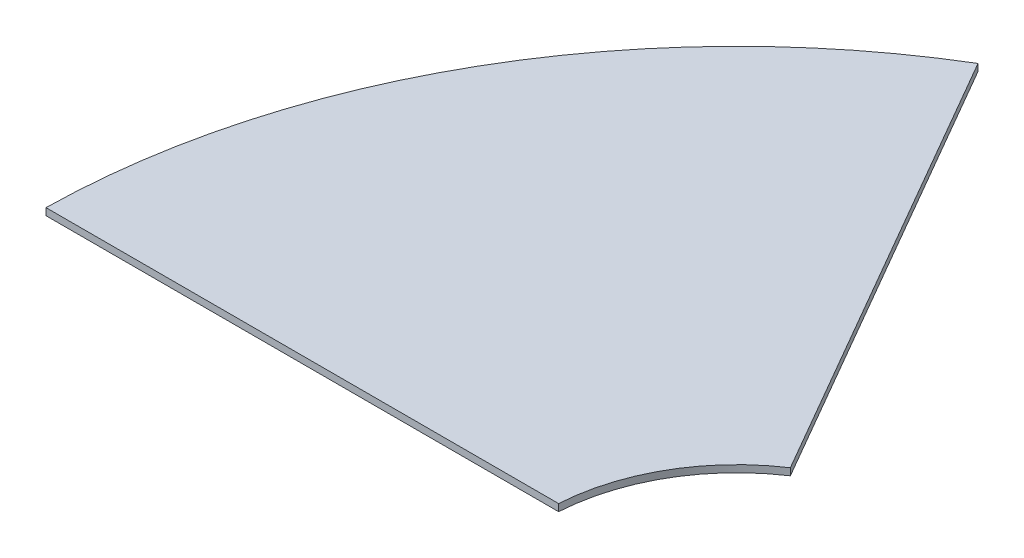
ISO-10303-21;
HEADER;
FILE_DESCRIPTION(('STEP AP214'),'2;1');
FILE_NAME('part.step','',(''),(''),'','','');
FILE_SCHEMA(('AUTOMOTIVE_DESIGN { 1 0 10303 214 1 1 1 1 }'));
ENDSEC;
DATA;
#1=APPLICATION_CONTEXT('core data for automotive mechanical design processes');
#2=APPLICATION_PROTOCOL_DEFINITION('international standard','automotive_design',2000,#1);
#3=PRODUCT_CONTEXT('',#1,'mechanical');
#4=PRODUCT('Part','Part','',(#3));
#5=PRODUCT_RELATED_PRODUCT_CATEGORY('part','',(#4));
#6=PRODUCT_DEFINITION_FORMATION('','',#4);
#7=PRODUCT_DEFINITION_CONTEXT('part definition',#1,'design');
#8=PRODUCT_DEFINITION('design','',#6,#7);
#9=PRODUCT_DEFINITION_SHAPE('','',#8);
#10=(LENGTH_UNIT() NAMED_UNIT(*) SI_UNIT(.MILLI.,.METRE.));
#11=(NAMED_UNIT(*) PLANE_ANGLE_UNIT() SI_UNIT($,.RADIAN.));
#12=(NAMED_UNIT(*) SI_UNIT($,.STERADIAN.) SOLID_ANGLE_UNIT());
#13=UNCERTAINTY_MEASURE_WITH_UNIT(LENGTH_MEASURE(1.E-05),#10,'distance_accuracy_value','');
#14=(GEOMETRIC_REPRESENTATION_CONTEXT(3) GLOBAL_UNCERTAINTY_ASSIGNED_CONTEXT((#13)) GLOBAL_UNIT_ASSIGNED_CONTEXT((#10,
#11,#12)) REPRESENTATION_CONTEXT('',''));
#15=CARTESIAN_POINT('',(0.,0.,0.));
#16=DIRECTION('',(0.,0.,1.));
#17=DIRECTION('',(1.,0.,0.));
#18=AXIS2_PLACEMENT_3D('',#15,#16,#17);
#19=CARTESIAN_POINT('',(1.11022302462516E-13,6.,0.));
#20=DIRECTION('',(0.,-1.,0.));
#21=DIRECTION('',(0.,0.,-1.));
#22=AXIS2_PLACEMENT_3D('',#19,#20,#21);
#23=CYLINDRICAL_SURFACE('',#22,599.6);
#24=CARTESIAN_POINT('',(1.11022302462516E-13,0.,0.));
#25=DIRECTION('',(0.,1.,0.));
#26=DIRECTION('',(0.,0.,1.));
#27=AXIS2_PLACEMENT_3D('',#24,#25,#26);
#28=CIRCLE('',#27,599.6);
#29=CARTESIAN_POINT('',(-599.516605274616,0.,-10.));
#30=VERTEX_POINT('',#29);
#31=CARTESIAN_POINT('',(-308.418556675151,0.,-514.196610158426));
#32=VERTEX_POINT('',#31);
#33=EDGE_CURVE('E102',#30,#32,#28,.F.);
#34=ORIENTED_EDGE('',*,*,#33,.F.);
#35=DIRECTION('',(0.,-1.,0.));
#36=VECTOR('',#35,1.);
#37=CARTESIAN_POINT('',(-599.516605274616,6.,-10.));
#38=LINE('',#37,#36);
#39=CARTESIAN_POINT('',(-599.516605274616,6.,-10.));
#40=VERTEX_POINT('',#39);
#41=EDGE_CURVE('E11',#40,#30,#38,.T.);
#42=ORIENTED_EDGE('',*,*,#41,.F.);
#43=CARTESIAN_POINT('',(1.11022302462516E-13,6.,0.));
#44=DIRECTION('',(0.,1.,0.));
#45=DIRECTION('',(0.,0.,1.));
#46=AXIS2_PLACEMENT_3D('',#43,#44,#45);
#47=CIRCLE('',#46,599.6);
#48=CARTESIAN_POINT('',(-308.418556675151,6.,-514.196610158426));
#49=VERTEX_POINT('',#48);
#50=EDGE_CURVE('E95',#40,#49,#47,.F.);
#51=ORIENTED_EDGE('',*,*,#50,.T.);
#52=DIRECTION('',(0.,-1.,0.));
#53=VECTOR('',#52,1.);
#54=CARTESIAN_POINT('',(-308.418556675151,6.,-514.196610158426));
#55=LINE('',#54,#53);
#56=EDGE_CURVE('E77',#49,#32,#55,.T.);
#57=ORIENTED_EDGE('',*,*,#56,.T.);
#58=EDGE_LOOP('',(#34,#42,#51,#57));
#59=FACE_BOUND('',#58,.T.);
#60=ADVANCED_FACE('F39',(#59),#23,.T.);
#61=CARTESIAN_POINT('',(0.,6.,-10.));
#62=DIRECTION('',(0.,0.,1.));
#63=DIRECTION('',(1.,0.,0.));
#64=AXIS2_PLACEMENT_3D('',#61,#62,#63);
#65=PLANE('',#64);
#66=DIRECTION('',(-1.,0.,0.));
#67=VECTOR('',#66,1.);
#68=CARTESIAN_POINT('',(0.,0.,-10.));
#69=LINE('',#68,#67);
#70=CARTESIAN_POINT('',(-162.091825827214,0.,-10.));
#71=VERTEX_POINT('',#70);
#72=EDGE_CURVE('E88',#71,#30,#69,.T.);
#73=ORIENTED_EDGE('',*,*,#72,.F.);
#74=DIRECTION('',(0.,-1.,0.));
#75=VECTOR('',#74,1.);
#76=CARTESIAN_POINT('',(-162.091825827214,6.,-10.));
#77=LINE('',#76,#75);
#78=CARTESIAN_POINT('',(-162.091825827214,6.,-10.));
#79=VERTEX_POINT('',#78);
#80=EDGE_CURVE('E47',#79,#71,#77,.T.);
#81=ORIENTED_EDGE('',*,*,#80,.F.);
#82=DIRECTION('',(-1.,0.,0.));
#83=VECTOR('',#82,1.);
#84=CARTESIAN_POINT('',(0.,6.,-10.));
#85=LINE('',#84,#83);
#86=EDGE_CURVE('E86',#79,#40,#85,.T.);
#87=ORIENTED_EDGE('',*,*,#86,.T.);
#88=ORIENTED_EDGE('',*,*,#41,.T.);
#89=EDGE_LOOP('',(#73,#81,#87,#88));
#90=FACE_BOUND('',#89,.T.);
#91=ADVANCED_FACE('F85',(#90),#65,.T.);
#92=CARTESIAN_POINT('',(0.,6.,0.));
#93=DIRECTION('',(0.,-1.,0.));
#94=DIRECTION('',(0.,0.,-1.));
#95=AXIS2_PLACEMENT_3D('',#92,#93,#94);
#96=CYLINDRICAL_SURFACE('',#95,162.4);
#97=CARTESIAN_POINT('',(0.,0.,0.));
#98=DIRECTION('',(0.,1.,0.));
#99=DIRECTION('',(0.,0.,1.));
#100=AXIS2_PLACEMENT_3D('',#97,#98,#99);
#101=CIRCLE('',#100,162.4);
#102=CARTESIAN_POINT('',(-89.7061669514525,0.,-135.37563891217));
#103=VERTEX_POINT('',#102);
#104=EDGE_CURVE('E106',#103,#71,#101,.T.);
#105=ORIENTED_EDGE('',*,*,#104,.F.);
#106=DIRECTION('',(0.,-1.,0.));
#107=VECTOR('',#106,1.);
#108=CARTESIAN_POINT('',(-89.7061669514525,6.,-135.37563891217));
#109=LINE('',#108,#107);
#110=CARTESIAN_POINT('',(-89.7061669514525,6.,-135.37563891217));
#111=VERTEX_POINT('',#110);
#112=EDGE_CURVE('E70',#111,#103,#109,.T.);
#113=ORIENTED_EDGE('',*,*,#112,.F.);
#114=CARTESIAN_POINT('',(0.,6.,0.));
#115=DIRECTION('',(0.,1.,0.));
#116=DIRECTION('',(0.,0.,1.));
#117=AXIS2_PLACEMENT_3D('',#114,#115,#116);
#118=CIRCLE('',#117,162.4);
#119=EDGE_CURVE('E94',#111,#79,#118,.T.);
#120=ORIENTED_EDGE('',*,*,#119,.T.);
#121=ORIENTED_EDGE('',*,*,#80,.T.);
#122=EDGE_LOOP('',(#105,#113,#120,#121));
#123=FACE_BOUND('',#122,.T.);
#124=ADVANCED_FACE('F97',(#123),#96,.F.);
#125=CARTESIAN_POINT('',(-8.66025403784625,6.,5.000000000001));
#126=DIRECTION('',(-0.866025403784442,0.,0.499999999999994));
#127=DIRECTION('',(0.499999999999994,0.,0.866025403784442));
#128=AXIS2_PLACEMENT_3D('',#125,#126,#127);
#129=PLANE('',#128);
#130=DIRECTION('',(-0.499999999999994,0.,-0.866025403784442));
#131=VECTOR('',#130,1.);
#132=CARTESIAN_POINT('',(-8.66025403784625,0.,5.000000000001));
#133=LINE('',#132,#131);
#134=EDGE_CURVE('E108',#103,#32,#133,.T.);
#135=ORIENTED_EDGE('',*,*,#134,.T.);
#136=ORIENTED_EDGE('',*,*,#56,.F.);
#137=DIRECTION('',(-0.499999999999994,0.,-0.866025403784442));
#138=VECTOR('',#137,1.);
#139=CARTESIAN_POINT('',(-8.66025403784625,6.,5.000000000001));
#140=LINE('',#139,#138);
#141=EDGE_CURVE('E55',#111,#49,#140,.T.);
#142=ORIENTED_EDGE('',*,*,#141,.F.);
#143=ORIENTED_EDGE('',*,*,#112,.T.);
#144=EDGE_LOOP('',(#135,#136,#142,#143));
#145=FACE_BOUND('',#144,.T.);
#146=ADVANCED_FACE('F118',(#145),#129,.F.);
#147=CARTESIAN_POINT('',(0.,6.,0.));
#148=DIRECTION('',(0.,1.,0.));
#149=DIRECTION('',(0.,0.,1.));
#150=AXIS2_PLACEMENT_3D('',#147,#148,#149);
#151=PLANE('',#150);
#152=ORIENTED_EDGE('',*,*,#50,.F.);
#153=ORIENTED_EDGE('',*,*,#86,.F.);
#154=ORIENTED_EDGE('',*,*,#119,.F.);
#155=ORIENTED_EDGE('',*,*,#141,.T.);
#156=EDGE_LOOP('',(#152,#153,#154,#155));
#157=FACE_BOUND('',#156,.T.);
#158=ADVANCED_FACE('F93',(#157),#151,.T.);
#159=CARTESIAN_POINT('',(0.,0.,0.));
#160=DIRECTION('',(0.,1.,0.));
#161=DIRECTION('',(0.,0.,1.));
#162=AXIS2_PLACEMENT_3D('',#159,#160,#161);
#163=PLANE('',#162);
#164=ORIENTED_EDGE('',*,*,#33,.T.);
#165=ORIENTED_EDGE('',*,*,#134,.F.);
#166=ORIENTED_EDGE('',*,*,#104,.T.);
#167=ORIENTED_EDGE('',*,*,#72,.T.);
#168=EDGE_LOOP('',(#164,#165,#166,#167));
#169=FACE_BOUND('',#168,.T.);
#170=ADVANCED_FACE('F123',(#169),#163,.F.);
#171=CLOSED_SHELL('',(#60,#91,#124,#146,#158,#170));
#172=MANIFOLD_SOLID_BREP('B2',#171);
#173=ADVANCED_BREP_SHAPE_REPRESENTATION('',(#18,#172),#14);
#174=SHAPE_DEFINITION_REPRESENTATION(#9,#173);
ENDSEC;
END-ISO-10303-21;
